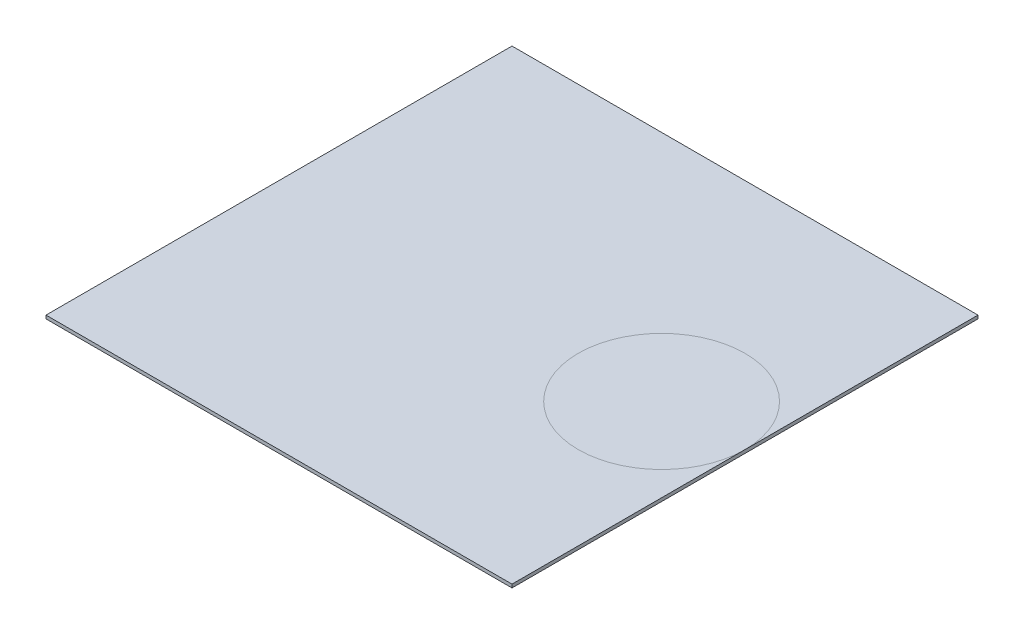
ISO-10303-21;
HEADER;
FILE_DESCRIPTION(('STEP AP214'),'2;1');
FILE_NAME('part.step','',(''),(''),'','','');
FILE_SCHEMA(('AUTOMOTIVE_DESIGN { 1 0 10303 214 1 1 1 1 }'));
ENDSEC;
DATA;
#1=APPLICATION_CONTEXT('core data for automotive mechanical design processes');
#2=APPLICATION_PROTOCOL_DEFINITION('international standard','automotive_design',2000,#1);
#3=PRODUCT_CONTEXT('',#1,'mechanical');
#4=PRODUCT('Part','Part','',(#3));
#5=PRODUCT_RELATED_PRODUCT_CATEGORY('part','',(#4));
#6=PRODUCT_DEFINITION_FORMATION('','',#4);
#7=PRODUCT_DEFINITION_CONTEXT('part definition',#1,'design');
#8=PRODUCT_DEFINITION('design','',#6,#7);
#9=PRODUCT_DEFINITION_SHAPE('','',#8);
#10=(LENGTH_UNIT() NAMED_UNIT(*) SI_UNIT(.MILLI.,.METRE.));
#11=(NAMED_UNIT(*) PLANE_ANGLE_UNIT() SI_UNIT($,.RADIAN.));
#12=(NAMED_UNIT(*) SI_UNIT($,.STERADIAN.) SOLID_ANGLE_UNIT());
#13=UNCERTAINTY_MEASURE_WITH_UNIT(LENGTH_MEASURE(1.E-05),#10,'distance_accuracy_value','');
#14=(GEOMETRIC_REPRESENTATION_CONTEXT(3) GLOBAL_UNCERTAINTY_ASSIGNED_CONTEXT((#13)) GLOBAL_UNIT_ASSIGNED_CONTEXT((#10,
#11,#12)) REPRESENTATION_CONTEXT('',''));
#15=CARTESIAN_POINT('',(0.,0.,0.));
#16=DIRECTION('',(0.,0.,1.));
#17=DIRECTION('',(1.,0.,0.));
#18=AXIS2_PLACEMENT_3D('',#15,#16,#17);
#19=CARTESIAN_POINT('',(0.,0.5,0.));
#20=DIRECTION('',(0.,-1.,0.));
#21=DIRECTION('',(0.,0.,-1.));
#22=AXIS2_PLACEMENT_3D('',#19,#20,#21);
#23=PLANE('',#22);
#24=DIRECTION('',(0.,0.,-1.));
#25=VECTOR('',#24,1.);
#26=CARTESIAN_POINT('',(69.85,0.5,69.85));
#27=LINE('',#26,#25);
#28=CARTESIAN_POINT('',(69.85,0.5,69.85));
#29=VERTEX_POINT('',#28);
#30=CARTESIAN_POINT('',(69.85,0.5,0.));
#31=VERTEX_POINT('',#30);
#32=EDGE_CURVE('E92',#29,#31,#27,.T.);
#33=ORIENTED_EDGE('',*,*,#32,.T.);
#34=CARTESIAN_POINT('',(44.85,0.5,0.));
#35=DIRECTION('',(0.,-1.,0.));
#36=DIRECTION('',(0.,0.,-1.));
#37=AXIS2_PLACEMENT_3D('',#34,#35,#36);
#38=CIRCLE('',#37,25.);
#39=EDGE_CURVE('E11',#31,#31,#38,.F.);
#40=ORIENTED_EDGE('',*,*,#39,.F.);
#41=CARTESIAN_POINT('',(69.85,0.5,-69.85));
#42=VERTEX_POINT('',#41);
#43=EDGE_CURVE('E82',#31,#42,#27,.T.);
#44=ORIENTED_EDGE('',*,*,#43,.T.);
#45=DIRECTION('',(-1.,0.,0.));
#46=VECTOR('',#45,1.);
#47=CARTESIAN_POINT('',(-69.85,0.5,-69.85));
#48=LINE('',#47,#46);
#49=CARTESIAN_POINT('',(-69.85,0.5,-69.85));
#50=VERTEX_POINT('',#49);
#51=EDGE_CURVE('E84',#42,#50,#48,.T.);
#52=ORIENTED_EDGE('',*,*,#51,.T.);
#53=DIRECTION('',(0.,0.,1.));
#54=VECTOR('',#53,1.);
#55=CARTESIAN_POINT('',(-69.85,0.5,69.85));
#56=LINE('',#55,#54);
#57=CARTESIAN_POINT('',(-69.85,0.5,69.85));
#58=VERTEX_POINT('',#57);
#59=EDGE_CURVE('E87',#50,#58,#56,.T.);
#60=ORIENTED_EDGE('',*,*,#59,.T.);
#61=DIRECTION('',(1.,0.,0.));
#62=VECTOR('',#61,1.);
#63=CARTESIAN_POINT('',(-69.85,0.5,69.85));
#64=LINE('',#63,#62);
#65=EDGE_CURVE('E57',#58,#29,#64,.T.);
#66=ORIENTED_EDGE('',*,*,#65,.T.);
#67=EDGE_LOOP('',(#33,#40,#44,#52,#60,#66));
#68=FACE_BOUND('',#67,.T.);
#69=ADVANCED_FACE('F37',(#68),#23,.F.);
#70=CARTESIAN_POINT('',(69.85,0.5,69.85));
#71=DIRECTION('',(-1.,0.,0.));
#72=DIRECTION('',(0.,0.,1.));
#73=AXIS2_PLACEMENT_3D('',#70,#71,#72);
#74=PLANE('',#73);
#75=DIRECTION('',(0.,0.,-1.));
#76=VECTOR('',#75,1.);
#77=CARTESIAN_POINT('',(69.85,-0.5,69.85));
#78=LINE('',#77,#76);
#79=CARTESIAN_POINT('',(69.85,-0.5,69.85));
#80=VERTEX_POINT('',#79);
#81=CARTESIAN_POINT('',(69.85,-0.5,-69.85));
#82=VERTEX_POINT('',#81);
#83=EDGE_CURVE('E108',#80,#82,#78,.T.);
#84=ORIENTED_EDGE('',*,*,#83,.T.);
#85=DIRECTION('',(0.,-1.,0.));
#86=VECTOR('',#85,1.);
#87=CARTESIAN_POINT('',(69.85,0.5,-69.85));
#88=LINE('',#87,#86);
#89=EDGE_CURVE('E46',#42,#82,#88,.T.);
#90=ORIENTED_EDGE('',*,*,#89,.F.);
#91=ORIENTED_EDGE('',*,*,#43,.F.);
#92=ORIENTED_EDGE('',*,*,#32,.F.);
#93=DIRECTION('',(0.,-1.,0.));
#94=VECTOR('',#93,1.);
#95=CARTESIAN_POINT('',(69.85,0.5,69.85));
#96=LINE('',#95,#94);
#97=EDGE_CURVE('E104',#29,#80,#96,.T.);
#98=ORIENTED_EDGE('',*,*,#97,.T.);
#99=EDGE_LOOP('',(#84,#90,#91,#92,#98));
#100=FACE_BOUND('',#99,.T.);
#101=ADVANCED_FACE('F39',(#100),#74,.F.);
#102=CARTESIAN_POINT('',(-69.85,0.5,-69.85));
#103=DIRECTION('',(0.,0.,1.));
#104=DIRECTION('',(1.,0.,0.));
#105=AXIS2_PLACEMENT_3D('',#102,#103,#104);
#106=PLANE('',#105);
#107=DIRECTION('',(-1.,0.,0.));
#108=VECTOR('',#107,1.);
#109=CARTESIAN_POINT('',(-69.85,-0.5,-69.85));
#110=LINE('',#109,#108);
#111=CARTESIAN_POINT('',(-69.85,-0.5,-69.85));
#112=VERTEX_POINT('',#111);
#113=EDGE_CURVE('E97',#82,#112,#110,.T.);
#114=ORIENTED_EDGE('',*,*,#113,.T.);
#115=DIRECTION('',(0.,-1.,0.));
#116=VECTOR('',#115,1.);
#117=CARTESIAN_POINT('',(-69.85,0.5,-69.85));
#118=LINE('',#117,#116);
#119=EDGE_CURVE('E95',#50,#112,#118,.T.);
#120=ORIENTED_EDGE('',*,*,#119,.F.);
#121=ORIENTED_EDGE('',*,*,#51,.F.);
#122=ORIENTED_EDGE('',*,*,#89,.T.);
#123=EDGE_LOOP('',(#114,#120,#121,#122));
#124=FACE_BOUND('',#123,.T.);
#125=ADVANCED_FACE('F96',(#124),#106,.F.);
#126=CARTESIAN_POINT('',(-69.85,0.5,69.85));
#127=DIRECTION('',(1.,0.,0.));
#128=DIRECTION('',(0.,0.,-1.));
#129=AXIS2_PLACEMENT_3D('',#126,#127,#128);
#130=PLANE('',#129);
#131=DIRECTION('',(0.,0.,1.));
#132=VECTOR('',#131,1.);
#133=CARTESIAN_POINT('',(-69.85,-0.5,69.85));
#134=LINE('',#133,#132);
#135=CARTESIAN_POINT('',(-69.85,-0.5,69.85));
#136=VERTEX_POINT('',#135);
#137=EDGE_CURVE('E112',#112,#136,#134,.T.);
#138=ORIENTED_EDGE('',*,*,#137,.T.);
#139=DIRECTION('',(0.,-1.,0.));
#140=VECTOR('',#139,1.);
#141=CARTESIAN_POINT('',(-69.85,0.5,69.85));
#142=LINE('',#141,#140);
#143=EDGE_CURVE('E100',#58,#136,#142,.T.);
#144=ORIENTED_EDGE('',*,*,#143,.F.);
#145=ORIENTED_EDGE('',*,*,#59,.F.);
#146=ORIENTED_EDGE('',*,*,#119,.T.);
#147=EDGE_LOOP('',(#138,#144,#145,#146));
#148=FACE_BOUND('',#147,.T.);
#149=ADVANCED_FACE('F102',(#148),#130,.F.);
#150=CARTESIAN_POINT('',(-69.85,0.5,69.85));
#151=DIRECTION('',(0.,0.,-1.));
#152=DIRECTION('',(-1.,0.,0.));
#153=AXIS2_PLACEMENT_3D('',#150,#151,#152);
#154=PLANE('',#153);
#155=DIRECTION('',(1.,0.,0.));
#156=VECTOR('',#155,1.);
#157=CARTESIAN_POINT('',(-69.85,-0.5,69.85));
#158=LINE('',#157,#156);
#159=EDGE_CURVE('E77',#136,#80,#158,.T.);
#160=ORIENTED_EDGE('',*,*,#159,.T.);
#161=ORIENTED_EDGE('',*,*,#97,.F.);
#162=ORIENTED_EDGE('',*,*,#65,.F.);
#163=ORIENTED_EDGE('',*,*,#143,.T.);
#164=EDGE_LOOP('',(#160,#161,#162,#163));
#165=FACE_BOUND('',#164,.T.);
#166=ADVANCED_FACE('F121',(#165),#154,.F.);
#167=ORIENTED_EDGE('',*,*,#39,.T.);
#168=EDGE_LOOP('',(#167));
#169=FACE_BOUND('',#168,.T.);
#170=ADVANCED_FACE('F123',(#169),#23,.F.);
#171=CARTESIAN_POINT('',(0.,-0.5,0.));
#172=DIRECTION('',(0.,-1.,0.));
#173=DIRECTION('',(0.,0.,-1.));
#174=AXIS2_PLACEMENT_3D('',#171,#172,#173);
#175=PLANE('',#174);
#176=ORIENTED_EDGE('',*,*,#83,.F.);
#177=ORIENTED_EDGE('',*,*,#159,.F.);
#178=ORIENTED_EDGE('',*,*,#137,.F.);
#179=ORIENTED_EDGE('',*,*,#113,.F.);
#180=EDGE_LOOP('',(#176,#177,#178,#179));
#181=FACE_BOUND('',#180,.T.);
#182=ADVANCED_FACE('F120',(#181),#175,.T.);
#183=CLOSED_SHELL('',(#69,#101,#125,#149,#166,#170,#182));
#184=MANIFOLD_SOLID_BREP('B2',#183);
#185=ADVANCED_BREP_SHAPE_REPRESENTATION('',(#18,#184),#14);
#186=SHAPE_DEFINITION_REPRESENTATION(#9,#185);
ENDSEC;
END-ISO-10303-21;
